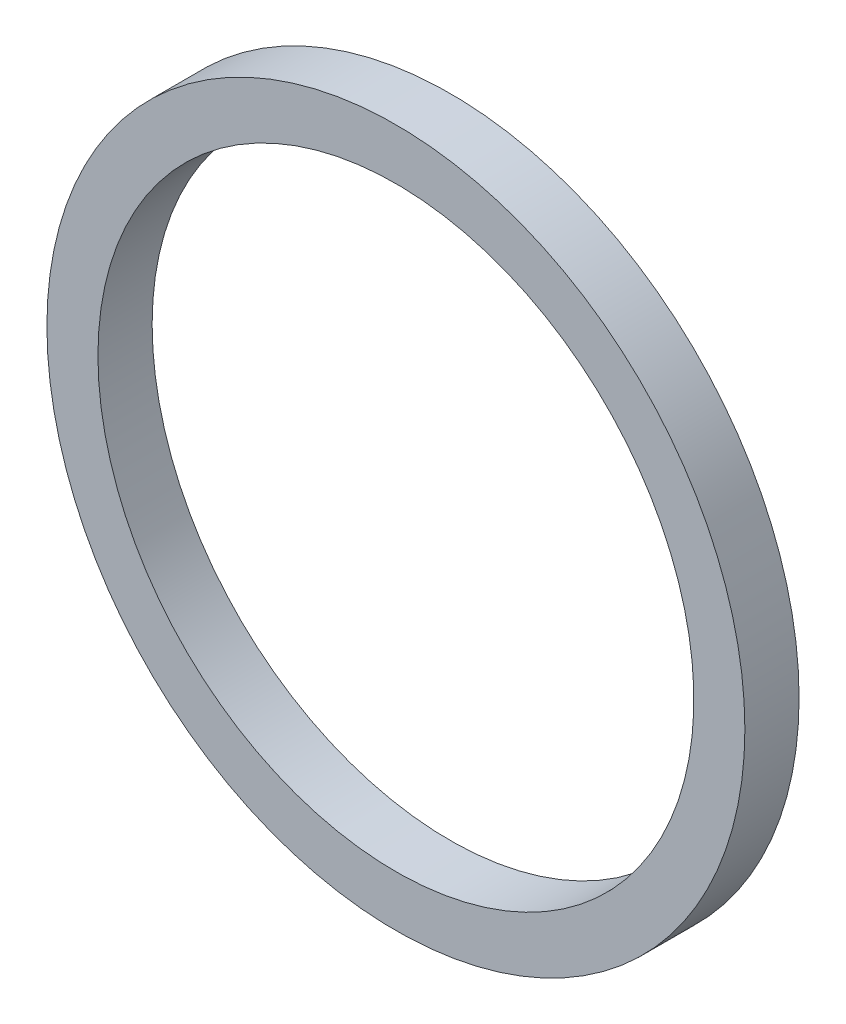
ISO-10303-21;
HEADER;
FILE_DESCRIPTION(('STEP AP214'),'2;1');
FILE_NAME('part.step','',(''),(''),'','','');
FILE_SCHEMA(('AUTOMOTIVE_DESIGN { 1 0 10303 214 1 1 1 1 }'));
ENDSEC;
DATA;
#1=APPLICATION_CONTEXT('core data for automotive mechanical design processes');
#2=APPLICATION_PROTOCOL_DEFINITION('international standard','automotive_design',2000,#1);
#3=PRODUCT_CONTEXT('',#1,'mechanical');
#4=PRODUCT('Part','Part','',(#3));
#5=PRODUCT_RELATED_PRODUCT_CATEGORY('part','',(#4));
#6=PRODUCT_DEFINITION_FORMATION('','',#4);
#7=PRODUCT_DEFINITION_CONTEXT('part definition',#1,'design');
#8=PRODUCT_DEFINITION('design','',#6,#7);
#9=PRODUCT_DEFINITION_SHAPE('','',#8);
#10=(LENGTH_UNIT() NAMED_UNIT(*) SI_UNIT(.MILLI.,.METRE.));
#11=(NAMED_UNIT(*) PLANE_ANGLE_UNIT() SI_UNIT($,.RADIAN.));
#12=(NAMED_UNIT(*) SI_UNIT($,.STERADIAN.) SOLID_ANGLE_UNIT());
#13=UNCERTAINTY_MEASURE_WITH_UNIT(LENGTH_MEASURE(1.E-05),#10,'distance_accuracy_value','');
#14=(GEOMETRIC_REPRESENTATION_CONTEXT(3) GLOBAL_UNCERTAINTY_ASSIGNED_CONTEXT((#13)) GLOBAL_UNIT_ASSIGNED_CONTEXT((#10,
#11,#12)) REPRESENTATION_CONTEXT('',''));
#15=CARTESIAN_POINT('',(0.,0.,0.));
#16=DIRECTION('',(0.,0.,1.));
#17=DIRECTION('',(1.,0.,0.));
#18=AXIS2_PLACEMENT_3D('',#15,#16,#17);
#19=CARTESIAN_POINT('',(0.,0.,3.32));
#20=DIRECTION('',(0.,0.,1.));
#21=DIRECTION('',(1.,0.,0.));
#22=AXIS2_PLACEMENT_3D('',#19,#20,#21);
#23=PLANE('',#22);
#24=CARTESIAN_POINT('',(0.,0.,3.32));
#25=DIRECTION('',(0.,0.,1.));
#26=DIRECTION('',(1.,0.,0.));
#27=AXIS2_PLACEMENT_3D('',#24,#25,#26);
#28=CIRCLE('',#27,21.375);
#29=CARTESIAN_POINT('',(-21.375,0.,3.32));
#30=VERTEX_POINT('',#29);
#31=EDGE_CURVE('E10',#30,#30,#28,.T.);
#32=ORIENTED_EDGE('',*,*,#31,.T.);
#33=EDGE_LOOP('',(#32));
#34=FACE_BOUND('',#33,.T.);
#35=CARTESIAN_POINT('',(0.,0.,3.32));
#36=DIRECTION('',(0.,0.,1.));
#37=DIRECTION('',(1.,0.,0.));
#38=AXIS2_PLACEMENT_3D('',#35,#36,#37);
#39=CIRCLE('',#38,18.25);
#40=CARTESIAN_POINT('',(-18.25,0.,3.32));
#41=VERTEX_POINT('',#40);
#42=EDGE_CURVE('E56',#41,#41,#39,.T.);
#43=ORIENTED_EDGE('',*,*,#42,.F.);
#44=EDGE_LOOP('',(#43));
#45=FACE_BOUND('',#44,.T.);
#46=ADVANCED_FACE('F43',(#34,#45),#23,.T.);
#47=CARTESIAN_POINT('',(0.,0.,0.));
#48=DIRECTION('',(0.,0.,1.));
#49=DIRECTION('',(1.,0.,0.));
#50=AXIS2_PLACEMENT_3D('',#47,#48,#49);
#51=PLANE('',#50);
#52=CARTESIAN_POINT('',(0.,0.,0.));
#53=DIRECTION('',(0.,0.,1.));
#54=DIRECTION('',(1.,0.,0.));
#55=AXIS2_PLACEMENT_3D('',#52,#53,#54);
#56=CIRCLE('',#55,21.375);
#57=CARTESIAN_POINT('',(-21.375,0.,0.));
#58=VERTEX_POINT('',#57);
#59=EDGE_CURVE('E47',#58,#58,#56,.T.);
#60=ORIENTED_EDGE('',*,*,#59,.F.);
#61=EDGE_LOOP('',(#60));
#62=FACE_BOUND('',#61,.T.);
#63=CARTESIAN_POINT('',(0.,0.,0.));
#64=DIRECTION('',(0.,0.,1.));
#65=DIRECTION('',(1.,0.,0.));
#66=AXIS2_PLACEMENT_3D('',#63,#64,#65);
#67=CIRCLE('',#66,18.25);
#68=CARTESIAN_POINT('',(-18.25,0.,0.));
#69=VERTEX_POINT('',#68);
#70=EDGE_CURVE('E58',#69,#69,#67,.T.);
#71=ORIENTED_EDGE('',*,*,#70,.T.);
#72=EDGE_LOOP('',(#71));
#73=FACE_BOUND('',#72,.T.);
#74=ADVANCED_FACE('F70',(#62,#73),#51,.F.);
#75=CARTESIAN_POINT('',(0.,0.,3.32));
#76=DIRECTION('',(0.,0.,-1.));
#77=DIRECTION('',(-1.,0.,0.));
#78=AXIS2_PLACEMENT_3D('',#75,#76,#77);
#79=CYLINDRICAL_SURFACE('',#78,21.375);
#80=CARTESIAN_POINT('',(-21.375,0.,3.32));
#81=CARTESIAN_POINT('',(-21.375,0.,3.28541666666667));
#82=CARTESIAN_POINT('',(-21.375,0.,3.25083333333333));
#83=CARTESIAN_POINT('',(-21.375,0.,3.18166666666667));
#84=CARTESIAN_POINT('',(-21.375,0.,3.14708333333333));
#85=CARTESIAN_POINT('',(-21.375,0.,3.07791666666667));
#86=CARTESIAN_POINT('',(-21.375,0.,3.04333333333333));
#87=CARTESIAN_POINT('',(-21.375,0.,2.97416666666667));
#88=CARTESIAN_POINT('',(-21.375,0.,2.93958333333333));
#89=CARTESIAN_POINT('',(-21.375,0.,2.87041666666667));
#90=CARTESIAN_POINT('',(-21.375,0.,2.83583333333333));
#91=CARTESIAN_POINT('',(-21.375,0.,2.76666666666667));
#92=CARTESIAN_POINT('',(-21.375,0.,2.73208333333333));
#93=CARTESIAN_POINT('',(-21.375,0.,2.66291666666667));
#94=CARTESIAN_POINT('',(-21.375,0.,2.62833333333333));
#95=CARTESIAN_POINT('',(-21.375,0.,2.55916666666667));
#96=CARTESIAN_POINT('',(-21.375,0.,2.52458333333333));
#97=CARTESIAN_POINT('',(-21.375,0.,2.45541666666667));
#98=CARTESIAN_POINT('',(-21.375,0.,2.42083333333333));
#99=CARTESIAN_POINT('',(-21.375,0.,2.35166666666667));
#100=CARTESIAN_POINT('',(-21.375,0.,2.31708333333333));
#101=CARTESIAN_POINT('',(-21.375,0.,2.24791666666667));
#102=CARTESIAN_POINT('',(-21.375,0.,2.21333333333333));
#103=CARTESIAN_POINT('',(-21.375,0.,2.14416666666667));
#104=CARTESIAN_POINT('',(-21.375,0.,2.10958333333333));
#105=CARTESIAN_POINT('',(-21.375,0.,2.04041666666667));
#106=CARTESIAN_POINT('',(-21.375,0.,2.00583333333333));
#107=CARTESIAN_POINT('',(-21.375,0.,1.93666666666667));
#108=CARTESIAN_POINT('',(-21.375,0.,1.90208333333333));
#109=CARTESIAN_POINT('',(-21.375,0.,1.83291666666667));
#110=CARTESIAN_POINT('',(-21.375,0.,1.79833333333333));
#111=CARTESIAN_POINT('',(-21.375,0.,1.72916666666667));
#112=CARTESIAN_POINT('',(-21.375,0.,1.69458333333333));
#113=CARTESIAN_POINT('',(-21.375,0.,1.62541666666667));
#114=CARTESIAN_POINT('',(-21.375,0.,1.59083333333333));
#115=CARTESIAN_POINT('',(-21.375,0.,1.52166666666667));
#116=CARTESIAN_POINT('',(-21.375,0.,1.48708333333333));
#117=CARTESIAN_POINT('',(-21.375,0.,1.41791666666667));
#118=CARTESIAN_POINT('',(-21.375,0.,1.38333333333333));
#119=CARTESIAN_POINT('',(-21.375,0.,1.31416666666667));
#120=CARTESIAN_POINT('',(-21.375,0.,1.27958333333333));
#121=CARTESIAN_POINT('',(-21.375,0.,1.21041666666667));
#122=CARTESIAN_POINT('',(-21.375,0.,1.17583333333333));
#123=CARTESIAN_POINT('',(-21.375,0.,1.10666666666667));
#124=CARTESIAN_POINT('',(-21.375,0.,1.07208333333333));
#125=CARTESIAN_POINT('',(-21.375,0.,1.00291666666667));
#126=CARTESIAN_POINT('',(-21.375,0.,0.968333333333333));
#127=CARTESIAN_POINT('',(-21.375,0.,0.899166666666666));
#128=CARTESIAN_POINT('',(-21.375,0.,0.864583333333333));
#129=CARTESIAN_POINT('',(-21.375,0.,0.795416666666666));
#130=CARTESIAN_POINT('',(-21.375,0.,0.760833333333333));
#131=CARTESIAN_POINT('',(-21.375,0.,0.691666666666666));
#132=CARTESIAN_POINT('',(-21.375,0.,0.657083333333333));
#133=CARTESIAN_POINT('',(-21.375,0.,0.587916666666666));
#134=CARTESIAN_POINT('',(-21.375,0.,0.553333333333333));
#135=CARTESIAN_POINT('',(-21.375,0.,0.484166666666666));
#136=CARTESIAN_POINT('',(-21.375,0.,0.449583333333333));
#137=CARTESIAN_POINT('',(-21.375,0.,0.380416666666666));
#138=CARTESIAN_POINT('',(-21.375,0.,0.345833333333333));
#139=CARTESIAN_POINT('',(-21.375,0.,0.276666666666666));
#140=CARTESIAN_POINT('',(-21.375,0.,0.242083333333333));
#141=CARTESIAN_POINT('',(-21.375,0.,0.172916666666666));
#142=CARTESIAN_POINT('',(-21.375,0.,0.138333333333333));
#143=CARTESIAN_POINT('',(-21.375,0.,0.0691666666666663));
#144=CARTESIAN_POINT('',(-21.375,0.,0.0345833333333329));
#145=CARTESIAN_POINT('',(-21.375,0.,0.));
#146=B_SPLINE_CURVE_WITH_KNOTS('',3,(#80,#81,#82,#83,#84,#85,#86,#87,#88,#89,#90,#91,#92,#93,
#94,#95,#96,#97,#98,#99,#100,#101,#102,#103,#104,#105,#106,#107,#108,#109,#110,#111,#112,#113,
#114,#115,#116,#117,#118,#119,#120,#121,#122,#123,#124,#125,#126,#127,#128,#129,#130,#131,#132,
#133,#134,#135,#136,#137,#138,#139,#140,#141,#142,#143,#144,#145),.UNSPECIFIED.,.F.,.F.,(4,2,2,
2,2,2,2,2,2,2,2,2,2,2,2,2,2,2,2,2,2,2,2,2,2,2,2,2,2,2,2,2,4),(0.,0.10375,0.2075,0.31125,0.415,
0.51875,0.6225,0.72625,0.83,0.93375,1.0375,1.14125,1.245,1.34875,1.4525,1.55625,1.66,1.76375,
1.8675,1.97125,2.075,2.17875,2.2825,2.38625,2.49,2.59375,2.6975,2.80125,2.905,3.00875,3.1125,
3.21625,3.32),.UNSPECIFIED.);
#147=EDGE_CURVE('BSEAM45',#30,#58,#146,.T.);
#148=ORIENTED_EDGE('',*,*,#31,.F.);
#149=ORIENTED_EDGE('',*,*,#59,.T.);
#150=ORIENTED_EDGE('',*,*,#147,.T.);
#151=ORIENTED_EDGE('',*,*,#147,.F.);
#152=EDGE_LOOP('',(#148,#150,#149,#151));
#153=FACE_BOUND('',#152,.T.);
#154=ADVANCED_FACE('F45',(#153),#79,.T.);
#155=CARTESIAN_POINT('',(0.,0.,3.32));
#156=DIRECTION('',(0.,0.,-1.));
#157=DIRECTION('',(-1.,0.,0.));
#158=AXIS2_PLACEMENT_3D('',#155,#156,#157);
#159=CYLINDRICAL_SURFACE('',#158,18.25);
#160=CARTESIAN_POINT('',(-18.25,0.,3.32));
#161=CARTESIAN_POINT('',(-18.25,0.,3.28541666666667));
#162=CARTESIAN_POINT('',(-18.25,0.,3.25083333333333));
#163=CARTESIAN_POINT('',(-18.25,0.,3.18166666666667));
#164=CARTESIAN_POINT('',(-18.25,0.,3.14708333333333));
#165=CARTESIAN_POINT('',(-18.25,0.,3.07791666666667));
#166=CARTESIAN_POINT('',(-18.25,0.,3.04333333333333));
#167=CARTESIAN_POINT('',(-18.25,0.,2.97416666666667));
#168=CARTESIAN_POINT('',(-18.25,0.,2.93958333333333));
#169=CARTESIAN_POINT('',(-18.25,0.,2.87041666666667));
#170=CARTESIAN_POINT('',(-18.25,0.,2.83583333333333));
#171=CARTESIAN_POINT('',(-18.25,0.,2.76666666666667));
#172=CARTESIAN_POINT('',(-18.25,0.,2.73208333333333));
#173=CARTESIAN_POINT('',(-18.25,0.,2.66291666666667));
#174=CARTESIAN_POINT('',(-18.25,0.,2.62833333333333));
#175=CARTESIAN_POINT('',(-18.25,0.,2.55916666666667));
#176=CARTESIAN_POINT('',(-18.25,0.,2.52458333333333));
#177=CARTESIAN_POINT('',(-18.25,0.,2.45541666666667));
#178=CARTESIAN_POINT('',(-18.25,0.,2.42083333333333));
#179=CARTESIAN_POINT('',(-18.25,0.,2.35166666666667));
#180=CARTESIAN_POINT('',(-18.25,0.,2.31708333333333));
#181=CARTESIAN_POINT('',(-18.25,0.,2.24791666666667));
#182=CARTESIAN_POINT('',(-18.25,0.,2.21333333333333));
#183=CARTESIAN_POINT('',(-18.25,0.,2.14416666666667));
#184=CARTESIAN_POINT('',(-18.25,0.,2.10958333333333));
#185=CARTESIAN_POINT('',(-18.25,0.,2.04041666666667));
#186=CARTESIAN_POINT('',(-18.25,0.,2.00583333333333));
#187=CARTESIAN_POINT('',(-18.25,0.,1.93666666666667));
#188=CARTESIAN_POINT('',(-18.25,0.,1.90208333333333));
#189=CARTESIAN_POINT('',(-18.25,0.,1.83291666666667));
#190=CARTESIAN_POINT('',(-18.25,0.,1.79833333333333));
#191=CARTESIAN_POINT('',(-18.25,0.,1.72916666666667));
#192=CARTESIAN_POINT('',(-18.25,0.,1.69458333333333));
#193=CARTESIAN_POINT('',(-18.25,0.,1.62541666666667));
#194=CARTESIAN_POINT('',(-18.25,0.,1.59083333333333));
#195=CARTESIAN_POINT('',(-18.25,0.,1.52166666666667));
#196=CARTESIAN_POINT('',(-18.25,0.,1.48708333333333));
#197=CARTESIAN_POINT('',(-18.25,0.,1.41791666666667));
#198=CARTESIAN_POINT('',(-18.25,0.,1.38333333333333));
#199=CARTESIAN_POINT('',(-18.25,0.,1.31416666666667));
#200=CARTESIAN_POINT('',(-18.25,0.,1.27958333333333));
#201=CARTESIAN_POINT('',(-18.25,0.,1.21041666666667));
#202=CARTESIAN_POINT('',(-18.25,0.,1.17583333333333));
#203=CARTESIAN_POINT('',(-18.25,0.,1.10666666666667));
#204=CARTESIAN_POINT('',(-18.25,0.,1.07208333333333));
#205=CARTESIAN_POINT('',(-18.25,0.,1.00291666666667));
#206=CARTESIAN_POINT('',(-18.25,0.,0.968333333333333));
#207=CARTESIAN_POINT('',(-18.25,0.,0.899166666666666));
#208=CARTESIAN_POINT('',(-18.25,0.,0.864583333333333));
#209=CARTESIAN_POINT('',(-18.25,0.,0.795416666666666));
#210=CARTESIAN_POINT('',(-18.25,0.,0.760833333333333));
#211=CARTESIAN_POINT('',(-18.25,0.,0.691666666666667));
#212=CARTESIAN_POINT('',(-18.25,0.,0.657083333333333));
#213=CARTESIAN_POINT('',(-18.25,0.,0.587916666666666));
#214=CARTESIAN_POINT('',(-18.25,0.,0.553333333333333));
#215=CARTESIAN_POINT('',(-18.25,0.,0.484166666666666));
#216=CARTESIAN_POINT('',(-18.25,0.,0.449583333333333));
#217=CARTESIAN_POINT('',(-18.25,0.,0.380416666666666));
#218=CARTESIAN_POINT('',(-18.25,0.,0.345833333333333));
#219=CARTESIAN_POINT('',(-18.25,0.,0.276666666666666));
#220=CARTESIAN_POINT('',(-18.25,0.,0.242083333333333));
#221=CARTESIAN_POINT('',(-18.25,0.,0.172916666666666));
#222=CARTESIAN_POINT('',(-18.25,0.,0.138333333333333));
#223=CARTESIAN_POINT('',(-18.25,0.,0.0691666666666663));
#224=CARTESIAN_POINT('',(-18.25,0.,0.0345833333333329));
#225=CARTESIAN_POINT('',(-18.25,0.,0.));
#226=B_SPLINE_CURVE_WITH_KNOTS('',3,(#160,#161,#162,#163,#164,#165,#166,#167,#168,#169,#170,
#171,#172,#173,#174,#175,#176,#177,#178,#179,#180,#181,#182,#183,#184,#185,#186,#187,#188,#189,
#190,#191,#192,#193,#194,#195,#196,#197,#198,#199,#200,#201,#202,#203,#204,#205,#206,#207,#208,
#209,#210,#211,#212,#213,#214,#215,#216,#217,#218,#219,#220,#221,#222,#223,#224,#225),
.UNSPECIFIED.,.F.,.F.,(4,2,2,2,2,2,2,2,2,2,2,2,2,2,2,2,2,2,2,2,2,2,2,2,2,2,2,2,2,2,2,2,4),(0.,
0.10375,0.2075,0.31125,0.415,0.51875,0.6225,0.72625,0.83,0.933750000000001,1.0375,1.14125,1.245,
1.34875,1.4525,1.55625,1.66,1.76375,1.8675,1.97125,2.075,2.17875,2.2825,2.38625,2.49,2.59375,
2.6975,2.80125,2.905,3.00875,3.1125,3.21625,3.32),.UNSPECIFIED.);
#227=EDGE_CURVE('BSEAM66',#41,#69,#226,.T.);
#228=ORIENTED_EDGE('',*,*,#42,.T.);
#229=ORIENTED_EDGE('',*,*,#70,.F.);
#230=ORIENTED_EDGE('',*,*,#227,.T.);
#231=ORIENTED_EDGE('',*,*,#227,.F.);
#232=EDGE_LOOP('',(#228,#230,#229,#231));
#233=FACE_BOUND('',#232,.T.);
#234=ADVANCED_FACE('F66',(#233),#159,.F.);
#235=CLOSED_SHELL('',(#46,#74,#154,#234));
#236=MANIFOLD_SOLID_BREP('B2',#235);
#237=ADVANCED_BREP_SHAPE_REPRESENTATION('',(#18,#236),#14);
#238=SHAPE_DEFINITION_REPRESENTATION(#9,#237);
ENDSEC;
END-ISO-10303-21;
